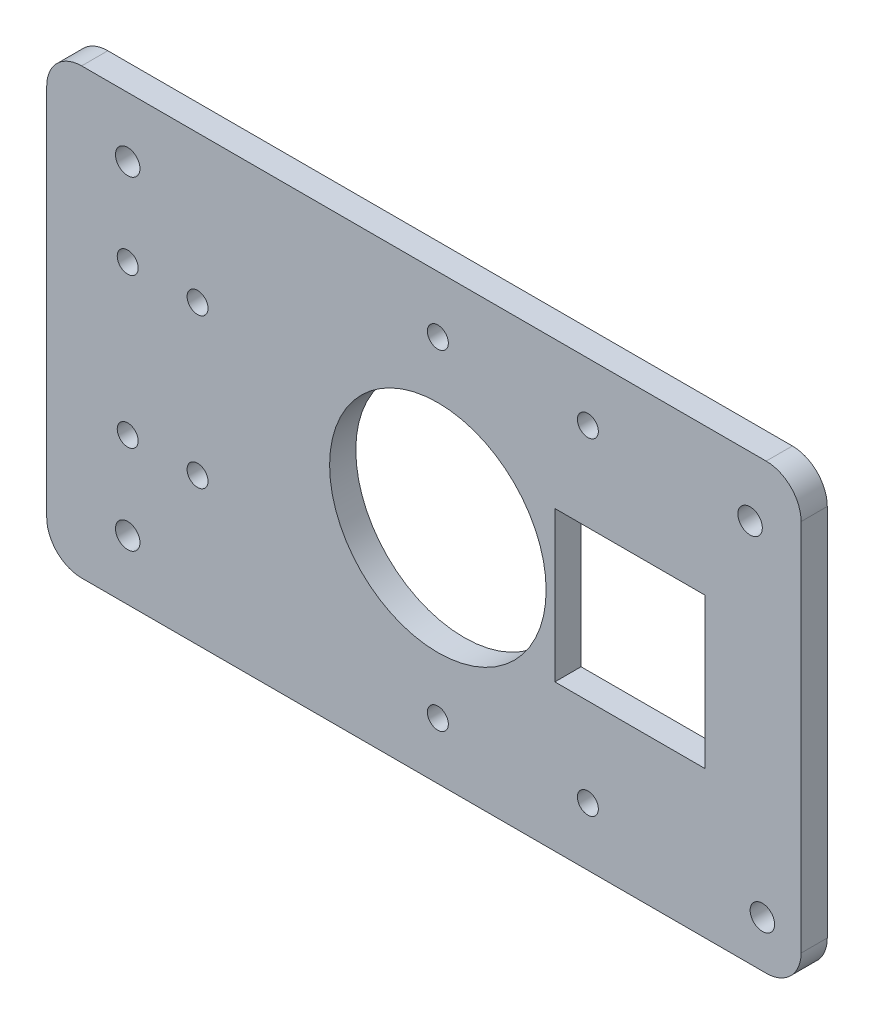
ISO-10303-21;
HEADER;
FILE_DESCRIPTION(('STEP AP214'),'2;1');
FILE_NAME('part.step','',(''),(''),'','','');
FILE_SCHEMA(('AUTOMOTIVE_DESIGN { 1 0 10303 214 1 1 1 1 }'));
ENDSEC;
DATA;
#1=APPLICATION_CONTEXT('core data for automotive mechanical design processes');
#2=APPLICATION_PROTOCOL_DEFINITION('international standard','automotive_design',2000,#1);
#3=PRODUCT_CONTEXT('',#1,'mechanical');
#4=PRODUCT('Part','Part','',(#3));
#5=PRODUCT_RELATED_PRODUCT_CATEGORY('part','',(#4));
#6=PRODUCT_DEFINITION_FORMATION('','',#4);
#7=PRODUCT_DEFINITION_CONTEXT('part definition',#1,'design');
#8=PRODUCT_DEFINITION('design','',#6,#7);
#9=PRODUCT_DEFINITION_SHAPE('','',#8);
#10=(LENGTH_UNIT() NAMED_UNIT(*) SI_UNIT(.MILLI.,.METRE.));
#11=(NAMED_UNIT(*) PLANE_ANGLE_UNIT() SI_UNIT($,.RADIAN.));
#12=(NAMED_UNIT(*) SI_UNIT($,.STERADIAN.) SOLID_ANGLE_UNIT());
#13=UNCERTAINTY_MEASURE_WITH_UNIT(LENGTH_MEASURE(1.E-05),#10,'distance_accuracy_value','');
#14=(GEOMETRIC_REPRESENTATION_CONTEXT(3) GLOBAL_UNCERTAINTY_ASSIGNED_CONTEXT((#13)) GLOBAL_UNIT_ASSIGNED_CONTEXT((#10,
#11,#12)) REPRESENTATION_CONTEXT('',''));
#15=CARTESIAN_POINT('',(0.,0.,0.));
#16=DIRECTION('',(0.,0.,1.));
#17=DIRECTION('',(1.,0.,0.));
#18=AXIS2_PLACEMENT_3D('',#15,#16,#17);
#19=CARTESIAN_POINT('',(0.,0.,17.5));
#20=DIRECTION('',(0.,0.,-1.));
#21=DIRECTION('',(-1.,0.,0.));
#22=AXIS2_PLACEMENT_3D('',#19,#20,#21);
#23=PLANE('',#22);
#24=CARTESIAN_POINT('',(-98.,53.5,17.5));
#25=DIRECTION('',(0.,0.,-1.));
#26=DIRECTION('',(-1.,0.,0.));
#27=AXIS2_PLACEMENT_3D('',#24,#25,#26);
#28=CIRCLE('',#27,10.);
#29=CARTESIAN_POINT('',(-98.,63.5,17.5));
#30=VERTEX_POINT('',#29);
#31=CARTESIAN_POINT('',(-108.,53.5,17.5));
#32=VERTEX_POINT('',#31);
#33=EDGE_CURVE('E173',#30,#32,#28,.F.);
#34=ORIENTED_EDGE('',*,*,#33,.T.);
#35=DIRECTION('',(0.,1.,0.));
#36=VECTOR('',#35,1.);
#37=CARTESIAN_POINT('',(-108.,63.5,17.5));
#38=LINE('',#37,#36);
#39=CARTESIAN_POINT('',(-108.,-53.5,17.5));
#40=VERTEX_POINT('',#39);
#41=EDGE_CURVE('E297',#40,#32,#38,.T.);
#42=ORIENTED_EDGE('',*,*,#41,.F.);
#43=CARTESIAN_POINT('',(-98.,-53.5,17.5));
#44=DIRECTION('',(0.,0.,-1.));
#45=DIRECTION('',(-1.,0.,0.));
#46=AXIS2_PLACEMENT_3D('',#43,#44,#45);
#47=CIRCLE('',#46,10.);
#48=CARTESIAN_POINT('',(-98.,-63.5,17.5));
#49=VERTEX_POINT('',#48);
#50=EDGE_CURVE('E177',#40,#49,#47,.F.);
#51=ORIENTED_EDGE('',*,*,#50,.T.);
#52=DIRECTION('',(-1.,0.,0.));
#53=VECTOR('',#52,1.);
#54=CARTESIAN_POINT('',(-108.,-63.5,17.5));
#55=LINE('',#54,#53);
#56=CARTESIAN_POINT('',(98.,-63.5,17.5));
#57=VERTEX_POINT('',#56);
#58=EDGE_CURVE('E238',#57,#49,#55,.T.);
#59=ORIENTED_EDGE('',*,*,#58,.F.);
#60=CARTESIAN_POINT('',(98.0000000000001,-53.5,17.5));
#61=DIRECTION('',(0.,0.,-1.));
#62=DIRECTION('',(-1.,0.,0.));
#63=AXIS2_PLACEMENT_3D('',#60,#61,#62);
#64=CIRCLE('',#63,10.);
#65=CARTESIAN_POINT('',(108.,-53.5,17.5));
#66=VERTEX_POINT('',#65);
#67=EDGE_CURVE('E183',#57,#66,#64,.F.);
#68=ORIENTED_EDGE('',*,*,#67,.T.);
#69=DIRECTION('',(0.,-1.,0.));
#70=VECTOR('',#69,1.);
#71=CARTESIAN_POINT('',(108.,63.5,17.5));
#72=LINE('',#71,#70);
#73=CARTESIAN_POINT('',(108.,53.5,17.5));
#74=VERTEX_POINT('',#73);
#75=EDGE_CURVE('E234',#74,#66,#72,.T.);
#76=ORIENTED_EDGE('',*,*,#75,.F.);
#77=CARTESIAN_POINT('',(98.,53.5,17.5));
#78=DIRECTION('',(0.,0.,-1.));
#79=DIRECTION('',(-1.,0.,0.));
#80=AXIS2_PLACEMENT_3D('',#77,#78,#79);
#81=CIRCLE('',#80,10.);
#82=CARTESIAN_POINT('',(98.,63.5,17.5));
#83=VERTEX_POINT('',#82);
#84=EDGE_CURVE('E180',#74,#83,#81,.F.);
#85=ORIENTED_EDGE('',*,*,#84,.T.);
#86=DIRECTION('',(1.,0.,0.));
#87=VECTOR('',#86,1.);
#88=CARTESIAN_POINT('',(-108.,63.5,17.5));
#89=LINE('',#88,#87);
#90=EDGE_CURVE('E298',#30,#83,#89,.T.);
#91=ORIENTED_EDGE('',*,*,#90,.F.);
#92=EDGE_LOOP('',(#34,#42,#51,#59,#68,#76,#85,#91));
#93=FACE_BOUND('',#92,.T.);
#94=CARTESIAN_POINT('',(4.00000000000006,0.,17.5));
#95=DIRECTION('',(0.,0.,-1.));
#96=DIRECTION('',(-1.,0.,0.));
#97=AXIS2_PLACEMENT_3D('',#94,#95,#96);
#98=CIRCLE('',#97,31.);
#99=CARTESIAN_POINT('',(-26.9999999999999,0.,17.5));
#100=VERTEX_POINT('',#99);
#101=EDGE_CURVE('E37',#100,#100,#98,.T.);
#102=ORIENTED_EDGE('',*,*,#101,.T.);
#103=EDGE_LOOP('',(#102));
#104=FACE_BOUND('',#103,.T.);
#105=DIRECTION('',(-1.,0.,0.));
#106=VECTOR('',#105,1.);
#107=CARTESIAN_POINT('',(37.5000000000001,21.5,17.5));
#108=LINE('',#107,#106);
#109=CARTESIAN_POINT('',(80.5000000000001,21.5,17.5));
#110=VERTEX_POINT('',#109);
#111=CARTESIAN_POINT('',(37.5000000000001,21.5,17.5));
#112=VERTEX_POINT('',#111);
#113=EDGE_CURVE('E138',#110,#112,#108,.T.);
#114=ORIENTED_EDGE('',*,*,#113,.F.);
#115=DIRECTION('',(0.,-1.,0.));
#116=VECTOR('',#115,1.);
#117=CARTESIAN_POINT('',(80.5000000000001,-21.5,17.5));
#118=LINE('',#117,#116);
#119=CARTESIAN_POINT('',(80.5000000000001,-21.5,17.5));
#120=VERTEX_POINT('',#119);
#121=EDGE_CURVE('E135',#110,#120,#118,.T.);
#122=ORIENTED_EDGE('',*,*,#121,.T.);
#123=DIRECTION('',(-1.,0.,0.));
#124=VECTOR('',#123,1.);
#125=CARTESIAN_POINT('',(37.5000000000001,-21.5,17.5));
#126=LINE('',#125,#124);
#127=CARTESIAN_POINT('',(37.5000000000001,-21.5,17.5));
#128=VERTEX_POINT('',#127);
#129=EDGE_CURVE('E124',#120,#128,#126,.T.);
#130=ORIENTED_EDGE('',*,*,#129,.T.);
#131=DIRECTION('',(0.,-1.,0.));
#132=VECTOR('',#131,1.);
#133=CARTESIAN_POINT('',(37.5000000000001,-21.5,17.5));
#134=LINE('',#133,#132);
#135=EDGE_CURVE('E244',#112,#128,#134,.T.);
#136=ORIENTED_EDGE('',*,*,#135,.F.);
#137=EDGE_LOOP('',(#114,#122,#130,#136));
#138=FACE_BOUND('',#137,.T.);
#139=CARTESIAN_POINT('',(-84.8116679666902,46.37,17.5));
#140=DIRECTION('',(0.,0.,-1.));
#141=DIRECTION('',(-1.,0.,0.));
#142=AXIS2_PLACEMENT_3D('',#139,#140,#141);
#143=CIRCLE('',#142,3.50000000000001);
#144=CARTESIAN_POINT('',(-88.3116679666902,46.37,17.5));
#145=VERTEX_POINT('',#144);
#146=EDGE_CURVE('E246',#145,#145,#143,.F.);
#147=ORIENTED_EDGE('',*,*,#146,.F.);
#148=EDGE_LOOP('',(#147));
#149=FACE_BOUND('',#148,.T.);
#150=CARTESIAN_POINT('',(96.9145553930181,-50.1725670547442,17.5));
#151=DIRECTION('',(0.,0.,-1.));
#152=DIRECTION('',(-1.,0.,0.));
#153=AXIS2_PLACEMENT_3D('',#150,#151,#152);
#154=CIRCLE('',#153,3.50000000000001);
#155=CARTESIAN_POINT('',(93.4145553930181,-50.1725670547442,17.5));
#156=VERTEX_POINT('',#155);
#157=EDGE_CURVE('E312',#156,#156,#154,.F.);
#158=ORIENTED_EDGE('',*,*,#157,.F.);
#159=EDGE_LOOP('',(#158));
#160=FACE_BOUND('',#159,.T.);
#161=CARTESIAN_POINT('',(4.00000000000006,47.25,17.5));
#162=DIRECTION('',(0.,0.,-1.));
#163=DIRECTION('',(-1.,0.,0.));
#164=AXIS2_PLACEMENT_3D('',#161,#162,#163);
#165=CIRCLE('',#164,3.);
#166=CARTESIAN_POINT('',(1.00000000000006,47.25,17.5));
#167=VERTEX_POINT('',#166);
#168=EDGE_CURVE('E251',#167,#167,#165,.F.);
#169=ORIENTED_EDGE('',*,*,#168,.F.);
#170=EDGE_LOOP('',(#169));
#171=FACE_BOUND('',#170,.T.);
#172=CARTESIAN_POINT('',(46.9495287272827,-46.81,17.5));
#173=DIRECTION('',(0.,0.,-1.));
#174=DIRECTION('',(-1.,0.,0.));
#175=AXIS2_PLACEMENT_3D('',#172,#173,#174);
#176=CIRCLE('',#175,2.99999999999999);
#177=CARTESIAN_POINT('',(43.9495287272827,-46.81,17.5));
#178=VERTEX_POINT('',#177);
#179=EDGE_CURVE('E187',#178,#178,#176,.T.);
#180=ORIENTED_EDGE('',*,*,#179,.T.);
#181=EDGE_LOOP('',(#180));
#182=FACE_BOUND('',#181,.T.);
#183=CARTESIAN_POINT('',(-84.8116679666902,21.435,17.5));
#184=DIRECTION('',(0.,0.,-1.));
#185=DIRECTION('',(-1.,0.,0.));
#186=AXIS2_PLACEMENT_3D('',#183,#184,#185);
#187=CIRCLE('',#186,2.99999999999999);
#188=CARTESIAN_POINT('',(-87.8116679666901,21.435,17.5));
#189=VERTEX_POINT('',#188);
#190=EDGE_CURVE('E255',#189,#189,#187,.F.);
#191=ORIENTED_EDGE('',*,*,#190,.F.);
#192=EDGE_LOOP('',(#191));
#193=FACE_BOUND('',#192,.T.);
#194=CARTESIAN_POINT('',(-84.8116679666902,-21.435,17.5));
#195=DIRECTION('',(0.,0.,-1.));
#196=DIRECTION('',(-1.,0.,0.));
#197=AXIS2_PLACEMENT_3D('',#194,#195,#196);
#198=CIRCLE('',#197,2.99999999999999);
#199=CARTESIAN_POINT('',(-87.8116679666901,-21.435,17.5));
#200=VERTEX_POINT('',#199);
#201=EDGE_CURVE('E199',#200,#200,#198,.T.);
#202=ORIENTED_EDGE('',*,*,#201,.T.);
#203=EDGE_LOOP('',(#202));
#204=FACE_BOUND('',#203,.T.);
#205=CARTESIAN_POINT('',(4.00000000000006,-47.25,17.5));
#206=DIRECTION('',(0.,0.,-1.));
#207=DIRECTION('',(-1.,0.,0.));
#208=AXIS2_PLACEMENT_3D('',#205,#206,#207);
#209=CIRCLE('',#208,3.);
#210=CARTESIAN_POINT('',(1.00000000000006,-47.25,17.5));
#211=VERTEX_POINT('',#210);
#212=EDGE_CURVE('E196',#211,#211,#209,.T.);
#213=ORIENTED_EDGE('',*,*,#212,.T.);
#214=EDGE_LOOP('',(#213));
#215=FACE_BOUND('',#214,.T.);
#216=CARTESIAN_POINT('',(-64.8116679666902,21.4349999999999,17.5));
#217=DIRECTION('',(0.,0.,-1.));
#218=DIRECTION('',(-1.,0.,0.));
#219=AXIS2_PLACEMENT_3D('',#216,#217,#218);
#220=CIRCLE('',#219,2.99999999999999);
#221=CARTESIAN_POINT('',(-67.8116679666901,21.4349999999999,17.5));
#222=VERTEX_POINT('',#221);
#223=EDGE_CURVE('E259',#222,#222,#220,.F.);
#224=ORIENTED_EDGE('',*,*,#223,.F.);
#225=EDGE_LOOP('',(#224));
#226=FACE_BOUND('',#225,.T.);
#227=CARTESIAN_POINT('',(-64.8116679666902,-21.4350000000001,17.5));
#228=DIRECTION('',(0.,0.,-1.));
#229=DIRECTION('',(-1.,0.,0.));
#230=AXIS2_PLACEMENT_3D('',#227,#228,#229);
#231=CIRCLE('',#230,2.99999999999999);
#232=CARTESIAN_POINT('',(-67.8116679666901,-21.4350000000001,17.5));
#233=VERTEX_POINT('',#232);
#234=EDGE_CURVE('E192',#233,#233,#231,.T.);
#235=ORIENTED_EDGE('',*,*,#234,.T.);
#236=EDGE_LOOP('',(#235));
#237=FACE_BOUND('',#236,.T.);
#238=CARTESIAN_POINT('',(46.9495287272827,46.81,17.5));
#239=DIRECTION('',(0.,0.,-1.));
#240=DIRECTION('',(-1.,0.,0.));
#241=AXIS2_PLACEMENT_3D('',#238,#239,#240);
#242=CIRCLE('',#241,2.99999999999999);
#243=CARTESIAN_POINT('',(43.9495287272827,46.81,17.5));
#244=VERTEX_POINT('',#243);
#245=EDGE_CURVE('E250',#244,#244,#242,.F.);
#246=ORIENTED_EDGE('',*,*,#245,.F.);
#247=EDGE_LOOP('',(#246));
#248=FACE_BOUND('',#247,.T.);
#249=CARTESIAN_POINT('',(93.3990574545653,46.37,17.5));
#250=DIRECTION('',(0.,0.,-1.));
#251=DIRECTION('',(-1.,0.,0.));
#252=AXIS2_PLACEMENT_3D('',#249,#250,#251);
#253=CIRCLE('',#252,3.50000000000001);
#254=CARTESIAN_POINT('',(89.8990574545653,46.37,17.5));
#255=VERTEX_POINT('',#254);
#256=EDGE_CURVE('E315',#255,#255,#253,.F.);
#257=ORIENTED_EDGE('',*,*,#256,.F.);
#258=EDGE_LOOP('',(#257));
#259=FACE_BOUND('',#258,.T.);
#260=CARTESIAN_POINT('',(-84.8116679666902,-46.37,17.5));
#261=DIRECTION('',(0.,0.,-1.));
#262=DIRECTION('',(-1.,0.,0.));
#263=AXIS2_PLACEMENT_3D('',#260,#261,#262);
#264=CIRCLE('',#263,3.50000000000001);
#265=CARTESIAN_POINT('',(-88.3116679666902,-46.37,17.5));
#266=VERTEX_POINT('',#265);
#267=EDGE_CURVE('E309',#266,#266,#264,.F.);
#268=ORIENTED_EDGE('',*,*,#267,.F.);
#269=EDGE_LOOP('',(#268));
#270=FACE_BOUND('',#269,.T.);
#271=ADVANCED_FACE('F33',(#93,#104,#138,#149,#160,#171,#182,#193,#204,#215,#226,#237,#248,#259,
#270),#23,.F.);
#272=CARTESIAN_POINT('',(0.,0.,10.));
#273=DIRECTION('',(0.,0.,-1.));
#274=DIRECTION('',(-1.,0.,0.));
#275=AXIS2_PLACEMENT_3D('',#272,#273,#274);
#276=PLANE('',#275);
#277=CARTESIAN_POINT('',(4.00000000000006,0.,10.));
#278=DIRECTION('',(0.,0.,-1.));
#279=DIRECTION('',(-1.,0.,0.));
#280=AXIS2_PLACEMENT_3D('',#277,#278,#279);
#281=CIRCLE('',#280,31.);
#282=CARTESIAN_POINT('',(-26.9999999999999,0.,10.));
#283=VERTEX_POINT('',#282);
#284=EDGE_CURVE('E185',#283,#283,#281,.F.);
#285=ORIENTED_EDGE('',*,*,#284,.T.);
#286=EDGE_LOOP('',(#285));
#287=FACE_BOUND('',#286,.T.);
#288=CARTESIAN_POINT('',(-84.8116679666902,-46.37,10.));
#289=DIRECTION('',(0.,0.,-1.));
#290=DIRECTION('',(-1.,0.,0.));
#291=AXIS2_PLACEMENT_3D('',#288,#289,#290);
#292=CIRCLE('',#291,3.50000000000001);
#293=CARTESIAN_POINT('',(-88.3116679666902,-46.37,10.));
#294=VERTEX_POINT('',#293);
#295=EDGE_CURVE('E336',#294,#294,#292,.F.);
#296=ORIENTED_EDGE('',*,*,#295,.T.);
#297=EDGE_LOOP('',(#296));
#298=FACE_BOUND('',#297,.T.);
#299=CARTESIAN_POINT('',(93.3990574545653,46.37,10.));
#300=DIRECTION('',(0.,0.,-1.));
#301=DIRECTION('',(-1.,0.,0.));
#302=AXIS2_PLACEMENT_3D('',#299,#300,#301);
#303=CIRCLE('',#302,3.50000000000001);
#304=CARTESIAN_POINT('',(89.8990574545653,46.37,10.));
#305=VERTEX_POINT('',#304);
#306=EDGE_CURVE('E332',#305,#305,#303,.F.);
#307=ORIENTED_EDGE('',*,*,#306,.T.);
#308=EDGE_LOOP('',(#307));
#309=FACE_BOUND('',#308,.T.);
#310=CARTESIAN_POINT('',(46.9495287272827,46.81,10.));
#311=DIRECTION('',(0.,0.,-1.));
#312=DIRECTION('',(-1.,0.,0.));
#313=AXIS2_PLACEMENT_3D('',#310,#311,#312);
#314=CIRCLE('',#313,2.99999999999999);
#315=CARTESIAN_POINT('',(43.9495287272827,46.81,10.));
#316=VERTEX_POINT('',#315);
#317=EDGE_CURVE('E191',#316,#316,#314,.F.);
#318=ORIENTED_EDGE('',*,*,#317,.T.);
#319=EDGE_LOOP('',(#318));
#320=FACE_BOUND('',#319,.T.);
#321=CARTESIAN_POINT('',(-64.8116679666902,-21.4350000000001,10.));
#322=DIRECTION('',(0.,0.,-1.));
#323=DIRECTION('',(-1.,0.,0.));
#324=AXIS2_PLACEMENT_3D('',#321,#322,#323);
#325=CIRCLE('',#324,2.99999999999999);
#326=CARTESIAN_POINT('',(-67.8116679666901,-21.4350000000001,10.));
#327=VERTEX_POINT('',#326);
#328=EDGE_CURVE('E252',#327,#327,#325,.T.);
#329=ORIENTED_EDGE('',*,*,#328,.F.);
#330=EDGE_LOOP('',(#329));
#331=FACE_BOUND('',#330,.T.);
#332=CARTESIAN_POINT('',(-64.8116679666902,21.4349999999999,10.));
#333=DIRECTION('',(0.,0.,-1.));
#334=DIRECTION('',(-1.,0.,0.));
#335=AXIS2_PLACEMENT_3D('',#332,#333,#334);
#336=CIRCLE('',#335,2.99999999999999);
#337=CARTESIAN_POINT('',(-67.8116679666901,21.4349999999999,10.));
#338=VERTEX_POINT('',#337);
#339=EDGE_CURVE('E198',#338,#338,#336,.F.);
#340=ORIENTED_EDGE('',*,*,#339,.T.);
#341=EDGE_LOOP('',(#340));
#342=FACE_BOUND('',#341,.T.);
#343=CARTESIAN_POINT('',(4.00000000000006,-47.25,10.));
#344=DIRECTION('',(0.,0.,-1.));
#345=DIRECTION('',(-1.,0.,0.));
#346=AXIS2_PLACEMENT_3D('',#343,#344,#345);
#347=CIRCLE('',#346,3.);
#348=CARTESIAN_POINT('',(1.00000000000006,-47.25,10.));
#349=VERTEX_POINT('',#348);
#350=EDGE_CURVE('E256',#349,#349,#347,.T.);
#351=ORIENTED_EDGE('',*,*,#350,.F.);
#352=EDGE_LOOP('',(#351));
#353=FACE_BOUND('',#352,.T.);
#354=CARTESIAN_POINT('',(-84.8116679666902,-21.435,10.));
#355=DIRECTION('',(0.,0.,-1.));
#356=DIRECTION('',(-1.,0.,0.));
#357=AXIS2_PLACEMENT_3D('',#354,#355,#356);
#358=CIRCLE('',#357,2.99999999999999);
#359=CARTESIAN_POINT('',(-87.8116679666901,-21.435,10.));
#360=VERTEX_POINT('',#359);
#361=EDGE_CURVE('E171',#360,#360,#358,.T.);
#362=ORIENTED_EDGE('',*,*,#361,.F.);
#363=EDGE_LOOP('',(#362));
#364=FACE_BOUND('',#363,.T.);
#365=CARTESIAN_POINT('',(-84.8116679666902,21.435,10.));
#366=DIRECTION('',(0.,0.,-1.));
#367=DIRECTION('',(-1.,0.,0.));
#368=AXIS2_PLACEMENT_3D('',#365,#366,#367);
#369=CIRCLE('',#368,2.99999999999999);
#370=CARTESIAN_POINT('',(-87.8116679666901,21.435,10.));
#371=VERTEX_POINT('',#370);
#372=EDGE_CURVE('E195',#371,#371,#369,.F.);
#373=ORIENTED_EDGE('',*,*,#372,.T.);
#374=EDGE_LOOP('',(#373));
#375=FACE_BOUND('',#374,.T.);
#376=CARTESIAN_POINT('',(46.9495287272827,-46.81,10.));
#377=DIRECTION('',(0.,0.,-1.));
#378=DIRECTION('',(-1.,0.,0.));
#379=AXIS2_PLACEMENT_3D('',#376,#377,#378);
#380=CIRCLE('',#379,2.99999999999999);
#381=CARTESIAN_POINT('',(43.9495287272827,-46.81,10.));
#382=VERTEX_POINT('',#381);
#383=EDGE_CURVE('E247',#382,#382,#380,.T.);
#384=ORIENTED_EDGE('',*,*,#383,.F.);
#385=EDGE_LOOP('',(#384));
#386=FACE_BOUND('',#385,.T.);
#387=CARTESIAN_POINT('',(4.00000000000006,47.25,10.));
#388=DIRECTION('',(0.,0.,-1.));
#389=DIRECTION('',(-1.,0.,0.));
#390=AXIS2_PLACEMENT_3D('',#387,#388,#389);
#391=CIRCLE('',#390,3.);
#392=CARTESIAN_POINT('',(1.00000000000006,47.25,10.));
#393=VERTEX_POINT('',#392);
#394=EDGE_CURVE('E190',#393,#393,#391,.F.);
#395=ORIENTED_EDGE('',*,*,#394,.T.);
#396=EDGE_LOOP('',(#395));
#397=FACE_BOUND('',#396,.T.);
#398=CARTESIAN_POINT('',(96.9145553930181,-50.1725670547442,10.));
#399=DIRECTION('',(0.,0.,-1.));
#400=DIRECTION('',(-1.,0.,0.));
#401=AXIS2_PLACEMENT_3D('',#398,#399,#400);
#402=CIRCLE('',#401,3.50000000000001);
#403=CARTESIAN_POINT('',(93.4145553930181,-50.1725670547442,10.));
#404=VERTEX_POINT('',#403);
#405=EDGE_CURVE('E280',#404,#404,#402,.F.);
#406=ORIENTED_EDGE('',*,*,#405,.T.);
#407=EDGE_LOOP('',(#406));
#408=FACE_BOUND('',#407,.T.);
#409=CARTESIAN_POINT('',(-84.8116679666902,46.37,10.));
#410=DIRECTION('',(0.,0.,-1.));
#411=DIRECTION('',(-1.,0.,0.));
#412=AXIS2_PLACEMENT_3D('',#409,#410,#411);
#413=CIRCLE('',#412,3.50000000000001);
#414=CARTESIAN_POINT('',(-88.3116679666902,46.37,10.));
#415=VERTEX_POINT('',#414);
#416=EDGE_CURVE('E141',#415,#415,#413,.F.);
#417=ORIENTED_EDGE('',*,*,#416,.T.);
#418=EDGE_LOOP('',(#417));
#419=FACE_BOUND('',#418,.T.);
#420=DIRECTION('',(-1.,0.,0.));
#421=VECTOR('',#420,1.);
#422=CARTESIAN_POINT('',(37.5000000000001,21.5,10.));
#423=LINE('',#422,#421);
#424=CARTESIAN_POINT('',(80.5000000000001,21.5,10.));
#425=VERTEX_POINT('',#424);
#426=CARTESIAN_POINT('',(37.5000000000001,21.5,10.));
#427=VERTEX_POINT('',#426);
#428=EDGE_CURVE('E131',#425,#427,#423,.T.);
#429=ORIENTED_EDGE('',*,*,#428,.T.);
#430=DIRECTION('',(0.,-1.,0.));
#431=VECTOR('',#430,1.);
#432=CARTESIAN_POINT('',(37.5000000000001,-21.5,10.));
#433=LINE('',#432,#431);
#434=CARTESIAN_POINT('',(37.5000000000001,-21.5,10.));
#435=VERTEX_POINT('',#434);
#436=EDGE_CURVE('E140',#427,#435,#433,.T.);
#437=ORIENTED_EDGE('',*,*,#436,.T.);
#438=DIRECTION('',(-1.,0.,0.));
#439=VECTOR('',#438,1.);
#440=CARTESIAN_POINT('',(37.5000000000001,-21.5,10.));
#441=LINE('',#440,#439);
#442=CARTESIAN_POINT('',(80.5000000000001,-21.5,10.));
#443=VERTEX_POINT('',#442);
#444=EDGE_CURVE('E232',#443,#435,#441,.T.);
#445=ORIENTED_EDGE('',*,*,#444,.F.);
#446=DIRECTION('',(0.,-1.,0.));
#447=VECTOR('',#446,1.);
#448=CARTESIAN_POINT('',(80.5000000000001,-21.5,10.));
#449=LINE('',#448,#447);
#450=EDGE_CURVE('E50',#425,#443,#449,.T.);
#451=ORIENTED_EDGE('',*,*,#450,.F.);
#452=EDGE_LOOP('',(#429,#437,#445,#451));
#453=FACE_BOUND('',#452,.T.);
#454=CARTESIAN_POINT('',(-98.,53.5,10.));
#455=DIRECTION('',(0.,0.,-1.));
#456=DIRECTION('',(-1.,0.,0.));
#457=AXIS2_PLACEMENT_3D('',#454,#455,#456);
#458=CIRCLE('',#457,10.);
#459=CARTESIAN_POINT('',(-98.,63.5,10.));
#460=VERTEX_POINT('',#459);
#461=CARTESIAN_POINT('',(-108.,53.5,10.));
#462=VERTEX_POINT('',#461);
#463=EDGE_CURVE('E235',#460,#462,#458,.F.);
#464=ORIENTED_EDGE('',*,*,#463,.F.);
#465=DIRECTION('',(1.,0.,0.));
#466=VECTOR('',#465,1.);
#467=CARTESIAN_POINT('',(-108.,63.5,10.));
#468=LINE('',#467,#466);
#469=CARTESIAN_POINT('',(98.,63.5,10.));
#470=VERTEX_POINT('',#469);
#471=EDGE_CURVE('E226',#460,#470,#468,.T.);
#472=ORIENTED_EDGE('',*,*,#471,.T.);
#473=CARTESIAN_POINT('',(98.,53.5,10.));
#474=DIRECTION('',(0.,0.,-1.));
#475=DIRECTION('',(-1.,0.,0.));
#476=AXIS2_PLACEMENT_3D('',#473,#474,#475);
#477=CIRCLE('',#476,10.);
#478=CARTESIAN_POINT('',(108.,53.5,10.));
#479=VERTEX_POINT('',#478);
#480=EDGE_CURVE('E240',#479,#470,#477,.F.);
#481=ORIENTED_EDGE('',*,*,#480,.F.);
#482=DIRECTION('',(0.,-1.,0.));
#483=VECTOR('',#482,1.);
#484=CARTESIAN_POINT('',(108.,63.5,10.));
#485=LINE('',#484,#483);
#486=CARTESIAN_POINT('',(108.,-53.5,10.));
#487=VERTEX_POINT('',#486);
#488=EDGE_CURVE('E132',#479,#487,#485,.T.);
#489=ORIENTED_EDGE('',*,*,#488,.T.);
#490=CARTESIAN_POINT('',(98.0000000000001,-53.5,10.));
#491=DIRECTION('',(0.,0.,-1.));
#492=DIRECTION('',(-1.,0.,0.));
#493=AXIS2_PLACEMENT_3D('',#490,#491,#492);
#494=CIRCLE('',#493,10.);
#495=CARTESIAN_POINT('',(98.,-63.5,10.));
#496=VERTEX_POINT('',#495);
#497=EDGE_CURVE('E242',#496,#487,#494,.F.);
#498=ORIENTED_EDGE('',*,*,#497,.F.);
#499=DIRECTION('',(-1.,0.,0.));
#500=VECTOR('',#499,1.);
#501=CARTESIAN_POINT('',(-108.,-63.5,10.));
#502=LINE('',#501,#500);
#503=CARTESIAN_POINT('',(-98.,-63.5,10.));
#504=VERTEX_POINT('',#503);
#505=EDGE_CURVE('E176',#496,#504,#502,.T.);
#506=ORIENTED_EDGE('',*,*,#505,.T.);
#507=CARTESIAN_POINT('',(-98.,-53.5,10.));
#508=DIRECTION('',(0.,0.,-1.));
#509=DIRECTION('',(-1.,0.,0.));
#510=AXIS2_PLACEMENT_3D('',#507,#508,#509);
#511=CIRCLE('',#510,10.);
#512=CARTESIAN_POINT('',(-108.,-53.5,10.));
#513=VERTEX_POINT('',#512);
#514=EDGE_CURVE('E237',#513,#504,#511,.F.);
#515=ORIENTED_EDGE('',*,*,#514,.F.);
#516=DIRECTION('',(0.,1.,0.));
#517=VECTOR('',#516,1.);
#518=CARTESIAN_POINT('',(-108.,63.5,10.));
#519=LINE('',#518,#517);
#520=EDGE_CURVE('E223',#513,#462,#519,.T.);
#521=ORIENTED_EDGE('',*,*,#520,.T.);
#522=EDGE_LOOP('',(#464,#472,#481,#489,#498,#506,#515,#521));
#523=FACE_BOUND('',#522,.T.);
#524=ADVANCED_FACE('F265',(#287,#298,#309,#320,#331,#342,#353,#364,#375,#386,#397,#408,#419,
#453,#523),#276,.T.);
#525=CARTESIAN_POINT('',(-84.8116679666902,-21.435,25.));
#526=DIRECTION('',(0.,0.,-1.));
#527=DIRECTION('',(-1.,0.,0.));
#528=AXIS2_PLACEMENT_3D('',#525,#526,#527);
#529=CYLINDRICAL_SURFACE('',#528,2.99999999999999);
#530=ORIENTED_EDGE('',*,*,#201,.F.);
#531=EDGE_LOOP('',(#530));
#532=FACE_BOUND('',#531,.T.);
#533=ORIENTED_EDGE('',*,*,#361,.T.);
#534=EDGE_LOOP('',(#533));
#535=FACE_BOUND('',#534,.T.);
#536=ADVANCED_FACE('F263',(#532,#535),#529,.F.);
#537=CARTESIAN_POINT('',(4.00000000000006,-47.25,25.));
#538=DIRECTION('',(0.,0.,-1.));
#539=DIRECTION('',(-1.,0.,0.));
#540=AXIS2_PLACEMENT_3D('',#537,#538,#539);
#541=CYLINDRICAL_SURFACE('',#540,3.);
#542=ORIENTED_EDGE('',*,*,#212,.F.);
#543=EDGE_LOOP('',(#542));
#544=FACE_BOUND('',#543,.T.);
#545=ORIENTED_EDGE('',*,*,#350,.T.);
#546=EDGE_LOOP('',(#545));
#547=FACE_BOUND('',#546,.T.);
#548=ADVANCED_FACE('F364',(#544,#547),#541,.F.);
#549=CARTESIAN_POINT('',(-64.8116679666902,21.4349999999999,25.));
#550=DIRECTION('',(0.,0.,-1.));
#551=DIRECTION('',(-1.,0.,0.));
#552=AXIS2_PLACEMENT_3D('',#549,#550,#551);
#553=CYLINDRICAL_SURFACE('',#552,2.99999999999999);
#554=ORIENTED_EDGE('',*,*,#223,.T.);
#555=EDGE_LOOP('',(#554));
#556=FACE_BOUND('',#555,.T.);
#557=ORIENTED_EDGE('',*,*,#339,.F.);
#558=EDGE_LOOP('',(#557));
#559=FACE_BOUND('',#558,.T.);
#560=ADVANCED_FACE('F368',(#556,#559),#553,.F.);
#561=CARTESIAN_POINT('',(-84.8116679666902,21.435,25.));
#562=DIRECTION('',(0.,0.,-1.));
#563=DIRECTION('',(-1.,0.,0.));
#564=AXIS2_PLACEMENT_3D('',#561,#562,#563);
#565=CYLINDRICAL_SURFACE('',#564,2.99999999999999);
#566=ORIENTED_EDGE('',*,*,#190,.T.);
#567=EDGE_LOOP('',(#566));
#568=FACE_BOUND('',#567,.T.);
#569=ORIENTED_EDGE('',*,*,#372,.F.);
#570=EDGE_LOOP('',(#569));
#571=FACE_BOUND('',#570,.T.);
#572=ADVANCED_FACE('F372',(#568,#571),#565,.F.);
#573=CARTESIAN_POINT('',(-64.8116679666902,-21.4350000000001,25.));
#574=DIRECTION('',(0.,0.,-1.));
#575=DIRECTION('',(-1.,0.,0.));
#576=AXIS2_PLACEMENT_3D('',#573,#574,#575);
#577=CYLINDRICAL_SURFACE('',#576,2.99999999999999);
#578=ORIENTED_EDGE('',*,*,#234,.F.);
#579=EDGE_LOOP('',(#578));
#580=FACE_BOUND('',#579,.T.);
#581=ORIENTED_EDGE('',*,*,#328,.T.);
#582=EDGE_LOOP('',(#581));
#583=FACE_BOUND('',#582,.T.);
#584=ADVANCED_FACE('F376',(#580,#583),#577,.F.);
#585=CARTESIAN_POINT('',(46.9495287272827,46.81,25.));
#586=DIRECTION('',(0.,0.,-1.));
#587=DIRECTION('',(-1.,0.,0.));
#588=AXIS2_PLACEMENT_3D('',#585,#586,#587);
#589=CYLINDRICAL_SURFACE('',#588,2.99999999999999);
#590=ORIENTED_EDGE('',*,*,#245,.T.);
#591=EDGE_LOOP('',(#590));
#592=FACE_BOUND('',#591,.T.);
#593=ORIENTED_EDGE('',*,*,#317,.F.);
#594=EDGE_LOOP('',(#593));
#595=FACE_BOUND('',#594,.T.);
#596=ADVANCED_FACE('F380',(#592,#595),#589,.F.);
#597=CARTESIAN_POINT('',(46.9495287272827,-46.81,25.));
#598=DIRECTION('',(0.,0.,-1.));
#599=DIRECTION('',(-1.,0.,0.));
#600=AXIS2_PLACEMENT_3D('',#597,#598,#599);
#601=CYLINDRICAL_SURFACE('',#600,2.99999999999999);
#602=ORIENTED_EDGE('',*,*,#179,.F.);
#603=EDGE_LOOP('',(#602));
#604=FACE_BOUND('',#603,.T.);
#605=ORIENTED_EDGE('',*,*,#383,.T.);
#606=EDGE_LOOP('',(#605));
#607=FACE_BOUND('',#606,.T.);
#608=ADVANCED_FACE('F384',(#604,#607),#601,.F.);
#609=CARTESIAN_POINT('',(4.00000000000006,47.25,25.));
#610=DIRECTION('',(0.,0.,-1.));
#611=DIRECTION('',(-1.,0.,0.));
#612=AXIS2_PLACEMENT_3D('',#609,#610,#611);
#613=CYLINDRICAL_SURFACE('',#612,3.);
#614=ORIENTED_EDGE('',*,*,#168,.T.);
#615=EDGE_LOOP('',(#614));
#616=FACE_BOUND('',#615,.T.);
#617=ORIENTED_EDGE('',*,*,#394,.F.);
#618=EDGE_LOOP('',(#617));
#619=FACE_BOUND('',#618,.T.);
#620=ADVANCED_FACE('F388',(#616,#619),#613,.F.);
#621=CARTESIAN_POINT('',(93.3990574545653,46.37,-53.75));
#622=DIRECTION('',(0.,0.,1.));
#623=DIRECTION('',(1.,0.,0.));
#624=AXIS2_PLACEMENT_3D('',#621,#622,#623);
#625=CYLINDRICAL_SURFACE('',#624,3.50000000000001);
#626=ORIENTED_EDGE('',*,*,#256,.T.);
#627=EDGE_LOOP('',(#626));
#628=FACE_BOUND('',#627,.T.);
#629=ORIENTED_EDGE('',*,*,#306,.F.);
#630=EDGE_LOOP('',(#629));
#631=FACE_BOUND('',#630,.T.);
#632=ADVANCED_FACE('F354',(#628,#631),#625,.F.);
#633=CARTESIAN_POINT('',(96.9145553930181,-50.1725670547442,-53.75));
#634=DIRECTION('',(0.,0.,1.));
#635=DIRECTION('',(1.,0.,0.));
#636=AXIS2_PLACEMENT_3D('',#633,#634,#635);
#637=CYLINDRICAL_SURFACE('',#636,3.50000000000001);
#638=ORIENTED_EDGE('',*,*,#157,.T.);
#639=EDGE_LOOP('',(#638));
#640=FACE_BOUND('',#639,.T.);
#641=ORIENTED_EDGE('',*,*,#405,.F.);
#642=EDGE_LOOP('',(#641));
#643=FACE_BOUND('',#642,.T.);
#644=ADVANCED_FACE('F345',(#640,#643),#637,.F.);
#645=CARTESIAN_POINT('',(-84.8116679666902,-46.37,-53.75));
#646=DIRECTION('',(0.,0.,1.));
#647=DIRECTION('',(1.,0.,0.));
#648=AXIS2_PLACEMENT_3D('',#645,#646,#647);
#649=CYLINDRICAL_SURFACE('',#648,3.50000000000001);
#650=ORIENTED_EDGE('',*,*,#267,.T.);
#651=EDGE_LOOP('',(#650));
#652=FACE_BOUND('',#651,.T.);
#653=ORIENTED_EDGE('',*,*,#295,.F.);
#654=EDGE_LOOP('',(#653));
#655=FACE_BOUND('',#654,.T.);
#656=ADVANCED_FACE('F342',(#652,#655),#649,.F.);
#657=CARTESIAN_POINT('',(-84.8116679666902,46.37,-53.75));
#658=DIRECTION('',(0.,0.,1.));
#659=DIRECTION('',(1.,0.,0.));
#660=AXIS2_PLACEMENT_3D('',#657,#658,#659);
#661=CYLINDRICAL_SURFACE('',#660,3.50000000000001);
#662=ORIENTED_EDGE('',*,*,#146,.T.);
#663=EDGE_LOOP('',(#662));
#664=FACE_BOUND('',#663,.T.);
#665=ORIENTED_EDGE('',*,*,#416,.F.);
#666=EDGE_LOOP('',(#665));
#667=FACE_BOUND('',#666,.T.);
#668=ADVANCED_FACE('F344',(#664,#667),#661,.F.);
#669=CARTESIAN_POINT('',(37.5000000000001,-21.5,25.));
#670=DIRECTION('',(0.,1.,0.));
#671=DIRECTION('',(-1.,0.,0.));
#672=AXIS2_PLACEMENT_3D('',#669,#670,#671);
#673=PLANE('',#672);
#674=ORIENTED_EDGE('',*,*,#129,.F.);
#675=DIRECTION('',(0.,0.,-1.));
#676=VECTOR('',#675,1.);
#677=CARTESIAN_POINT('',(80.5000000000001,-21.5,25.));
#678=LINE('',#677,#676);
#679=EDGE_CURVE('E128',#120,#443,#678,.T.);
#680=ORIENTED_EDGE('',*,*,#679,.T.);
#681=ORIENTED_EDGE('',*,*,#444,.T.);
#682=DIRECTION('',(0.,0.,-1.));
#683=VECTOR('',#682,1.);
#684=CARTESIAN_POINT('',(37.5000000000001,-21.5,25.));
#685=LINE('',#684,#683);
#686=EDGE_CURVE('E129',#128,#435,#685,.T.);
#687=ORIENTED_EDGE('',*,*,#686,.F.);
#688=EDGE_LOOP('',(#674,#680,#681,#687));
#689=FACE_BOUND('',#688,.T.);
#690=ADVANCED_FACE('F126',(#689),#673,.T.);
#691=CARTESIAN_POINT('',(37.5000000000001,21.5,25.));
#692=DIRECTION('',(0.,1.,0.));
#693=DIRECTION('',(-1.,0.,0.));
#694=AXIS2_PLACEMENT_3D('',#691,#692,#693);
#695=PLANE('',#694);
#696=DIRECTION('',(0.,0.,-1.));
#697=VECTOR('',#696,1.);
#698=CARTESIAN_POINT('',(80.5000000000001,21.5,25.));
#699=LINE('',#698,#697);
#700=EDGE_CURVE('E42',#110,#425,#699,.T.);
#701=ORIENTED_EDGE('',*,*,#700,.F.);
#702=ORIENTED_EDGE('',*,*,#113,.T.);
#703=DIRECTION('',(0.,0.,-1.));
#704=VECTOR('',#703,1.);
#705=CARTESIAN_POINT('',(37.5000000000001,21.5,25.));
#706=LINE('',#705,#704);
#707=EDGE_CURVE('E11',#112,#427,#706,.T.);
#708=ORIENTED_EDGE('',*,*,#707,.T.);
#709=ORIENTED_EDGE('',*,*,#428,.F.);
#710=EDGE_LOOP('',(#701,#702,#708,#709));
#711=FACE_BOUND('',#710,.T.);
#712=ADVANCED_FACE('F441',(#711),#695,.F.);
#713=CARTESIAN_POINT('',(80.5000000000001,-21.5,25.));
#714=DIRECTION('',(-1.,0.,0.));
#715=DIRECTION('',(0.,0.,1.));
#716=AXIS2_PLACEMENT_3D('',#713,#714,#715);
#717=PLANE('',#716);
#718=ORIENTED_EDGE('',*,*,#121,.F.);
#719=ORIENTED_EDGE('',*,*,#700,.T.);
#720=ORIENTED_EDGE('',*,*,#450,.T.);
#721=ORIENTED_EDGE('',*,*,#679,.F.);
#722=EDGE_LOOP('',(#718,#719,#720,#721));
#723=FACE_BOUND('',#722,.T.);
#724=ADVANCED_FACE('F143',(#723),#717,.T.);
#725=CARTESIAN_POINT('',(37.5000000000001,-21.5,25.));
#726=DIRECTION('',(-1.,0.,0.));
#727=DIRECTION('',(0.,-1.,0.));
#728=AXIS2_PLACEMENT_3D('',#725,#726,#727);
#729=PLANE('',#728);
#730=ORIENTED_EDGE('',*,*,#707,.F.);
#731=ORIENTED_EDGE('',*,*,#135,.T.);
#732=ORIENTED_EDGE('',*,*,#686,.T.);
#733=ORIENTED_EDGE('',*,*,#436,.F.);
#734=EDGE_LOOP('',(#730,#731,#732,#733));
#735=FACE_BOUND('',#734,.T.);
#736=ADVANCED_FACE('F211',(#735),#729,.F.);
#737=CARTESIAN_POINT('',(4.00000000000006,0.,17.5));
#738=DIRECTION('',(0.,0.,-1.));
#739=DIRECTION('',(-1.,0.,0.));
#740=AXIS2_PLACEMENT_3D('',#737,#738,#739);
#741=CYLINDRICAL_SURFACE('',#740,31.);
#742=ORIENTED_EDGE('',*,*,#101,.F.);
#743=EDGE_LOOP('',(#742));
#744=FACE_BOUND('',#743,.T.);
#745=ORIENTED_EDGE('',*,*,#284,.F.);
#746=EDGE_LOOP('',(#745));
#747=FACE_BOUND('',#746,.T.);
#748=ADVANCED_FACE('F207',(#744,#747),#741,.F.);
#749=CARTESIAN_POINT('',(108.,63.5,25.));
#750=DIRECTION('',(-1.,0.,0.));
#751=DIRECTION('',(0.,-1.,0.));
#752=AXIS2_PLACEMENT_3D('',#749,#750,#751);
#753=PLANE('',#752);
#754=DIRECTION('',(0.,0.,-1.));
#755=VECTOR('',#754,1.);
#756=CARTESIAN_POINT('',(108.,53.5,25.));
#757=LINE('',#756,#755);
#758=EDGE_CURVE('E169',#479,#74,#757,.F.);
#759=ORIENTED_EDGE('',*,*,#758,.T.);
#760=ORIENTED_EDGE('',*,*,#75,.T.);
#761=DIRECTION('',(0.,0.,-1.));
#762=VECTOR('',#761,1.);
#763=CARTESIAN_POINT('',(108.,-53.5,25.));
#764=LINE('',#763,#762);
#765=EDGE_CURVE('E166',#66,#487,#764,.T.);
#766=ORIENTED_EDGE('',*,*,#765,.T.);
#767=ORIENTED_EDGE('',*,*,#488,.F.);
#768=EDGE_LOOP('',(#759,#760,#766,#767));
#769=FACE_BOUND('',#768,.T.);
#770=ADVANCED_FACE('F210',(#769),#753,.F.);
#771=CARTESIAN_POINT('',(-108.,63.5,25.));
#772=DIRECTION('',(0.,-1.,0.));
#773=DIRECTION('',(0.,0.,-1.));
#774=AXIS2_PLACEMENT_3D('',#771,#772,#773);
#775=PLANE('',#774);
#776=DIRECTION('',(0.,0.,-1.));
#777=VECTOR('',#776,1.);
#778=CARTESIAN_POINT('',(-98.,63.5,25.));
#779=LINE('',#778,#777);
#780=EDGE_CURVE('E151',#460,#30,#779,.F.);
#781=ORIENTED_EDGE('',*,*,#780,.T.);
#782=ORIENTED_EDGE('',*,*,#90,.T.);
#783=DIRECTION('',(0.,0.,-1.));
#784=VECTOR('',#783,1.);
#785=CARTESIAN_POINT('',(98.,63.5,25.));
#786=LINE('',#785,#784);
#787=EDGE_CURVE('E163',#83,#470,#786,.T.);
#788=ORIENTED_EDGE('',*,*,#787,.T.);
#789=ORIENTED_EDGE('',*,*,#471,.F.);
#790=EDGE_LOOP('',(#781,#782,#788,#789));
#791=FACE_BOUND('',#790,.T.);
#792=ADVANCED_FACE('F291',(#791),#775,.F.);
#793=CARTESIAN_POINT('',(-108.,63.5,25.));
#794=DIRECTION('',(1.,0.,0.));
#795=DIRECTION('',(0.,1.,0.));
#796=AXIS2_PLACEMENT_3D('',#793,#794,#795);
#797=PLANE('',#796);
#798=DIRECTION('',(0.,0.,-1.));
#799=VECTOR('',#798,1.);
#800=CARTESIAN_POINT('',(-108.,-53.5,25.));
#801=LINE('',#800,#799);
#802=EDGE_CURVE('E160',#513,#40,#801,.F.);
#803=ORIENTED_EDGE('',*,*,#802,.T.);
#804=ORIENTED_EDGE('',*,*,#41,.T.);
#805=DIRECTION('',(0.,0.,-1.));
#806=VECTOR('',#805,1.);
#807=CARTESIAN_POINT('',(-108.,53.5,25.));
#808=LINE('',#807,#806);
#809=EDGE_CURVE('E146',#32,#462,#808,.T.);
#810=ORIENTED_EDGE('',*,*,#809,.T.);
#811=ORIENTED_EDGE('',*,*,#520,.F.);
#812=EDGE_LOOP('',(#803,#804,#810,#811));
#813=FACE_BOUND('',#812,.T.);
#814=ADVANCED_FACE('F492',(#813),#797,.F.);
#815=CARTESIAN_POINT('',(-108.,-63.5,25.));
#816=DIRECTION('',(0.,1.,0.));
#817=DIRECTION('',(0.,0.,1.));
#818=AXIS2_PLACEMENT_3D('',#815,#816,#817);
#819=PLANE('',#818);
#820=DIRECTION('',(0.,0.,-1.));
#821=VECTOR('',#820,1.);
#822=CARTESIAN_POINT('',(98.,-63.5,25.));
#823=LINE('',#822,#821);
#824=EDGE_CURVE('E154',#496,#57,#823,.F.);
#825=ORIENTED_EDGE('',*,*,#824,.T.);
#826=ORIENTED_EDGE('',*,*,#58,.T.);
#827=DIRECTION('',(0.,0.,-1.));
#828=VECTOR('',#827,1.);
#829=CARTESIAN_POINT('',(-98.,-63.5,25.));
#830=LINE('',#829,#828);
#831=EDGE_CURVE('E157',#49,#504,#830,.T.);
#832=ORIENTED_EDGE('',*,*,#831,.T.);
#833=ORIENTED_EDGE('',*,*,#505,.F.);
#834=EDGE_LOOP('',(#825,#826,#832,#833));
#835=FACE_BOUND('',#834,.T.);
#836=ADVANCED_FACE('F501',(#835),#819,.F.);
#837=CARTESIAN_POINT('',(-98.,53.5,25.));
#838=DIRECTION('',(0.,0.,-1.));
#839=DIRECTION('',(-1.,0.,0.));
#840=AXIS2_PLACEMENT_3D('',#837,#838,#839);
#841=CYLINDRICAL_SURFACE('',#840,10.);
#842=ORIENTED_EDGE('',*,*,#33,.F.);
#843=ORIENTED_EDGE('',*,*,#780,.F.);
#844=ORIENTED_EDGE('',*,*,#463,.T.);
#845=ORIENTED_EDGE('',*,*,#809,.F.);
#846=EDGE_LOOP('',(#842,#843,#844,#845));
#847=FACE_BOUND('',#846,.T.);
#848=ADVANCED_FACE('F294',(#847),#841,.T.);
#849=CARTESIAN_POINT('',(-98.,-53.5,25.));
#850=DIRECTION('',(0.,0.,-1.));
#851=DIRECTION('',(-1.,0.,0.));
#852=AXIS2_PLACEMENT_3D('',#849,#850,#851);
#853=CYLINDRICAL_SURFACE('',#852,10.);
#854=ORIENTED_EDGE('',*,*,#50,.F.);
#855=ORIENTED_EDGE('',*,*,#802,.F.);
#856=ORIENTED_EDGE('',*,*,#514,.T.);
#857=ORIENTED_EDGE('',*,*,#831,.F.);
#858=EDGE_LOOP('',(#854,#855,#856,#857));
#859=FACE_BOUND('',#858,.T.);
#860=ADVANCED_FACE('F520',(#859),#853,.T.);
#861=CARTESIAN_POINT('',(98.,53.5,25.));
#862=DIRECTION('',(0.,0.,-1.));
#863=DIRECTION('',(-1.,0.,0.));
#864=AXIS2_PLACEMENT_3D('',#861,#862,#863);
#865=CYLINDRICAL_SURFACE('',#864,10.);
#866=ORIENTED_EDGE('',*,*,#84,.F.);
#867=ORIENTED_EDGE('',*,*,#758,.F.);
#868=ORIENTED_EDGE('',*,*,#480,.T.);
#869=ORIENTED_EDGE('',*,*,#787,.F.);
#870=EDGE_LOOP('',(#866,#867,#868,#869));
#871=FACE_BOUND('',#870,.T.);
#872=ADVANCED_FACE('F529',(#871),#865,.T.);
#873=CARTESIAN_POINT('',(98.0000000000001,-53.5,25.));
#874=DIRECTION('',(0.,0.,-1.));
#875=DIRECTION('',(-1.,0.,0.));
#876=AXIS2_PLACEMENT_3D('',#873,#874,#875);
#877=CYLINDRICAL_SURFACE('',#876,10.);
#878=ORIENTED_EDGE('',*,*,#67,.F.);
#879=ORIENTED_EDGE('',*,*,#824,.F.);
#880=ORIENTED_EDGE('',*,*,#497,.T.);
#881=ORIENTED_EDGE('',*,*,#765,.F.);
#882=EDGE_LOOP('',(#878,#879,#880,#881));
#883=FACE_BOUND('',#882,.T.);
#884=ADVANCED_FACE('F35',(#883),#877,.T.);
#885=CLOSED_SHELL('',(#271,#524,#536,#548,#560,#572,#584,#596,#608,#620,#632,#644,#656,#668,
#690,#712,#724,#736,#748,#770,#792,#814,#836,#848,#860,#872,#884));
#886=MANIFOLD_SOLID_BREP('B2',#885);
#887=ADVANCED_BREP_SHAPE_REPRESENTATION('',(#18,#886),#14);
#888=SHAPE_DEFINITION_REPRESENTATION(#9,#887);
ENDSEC;
END-ISO-10303-21;
